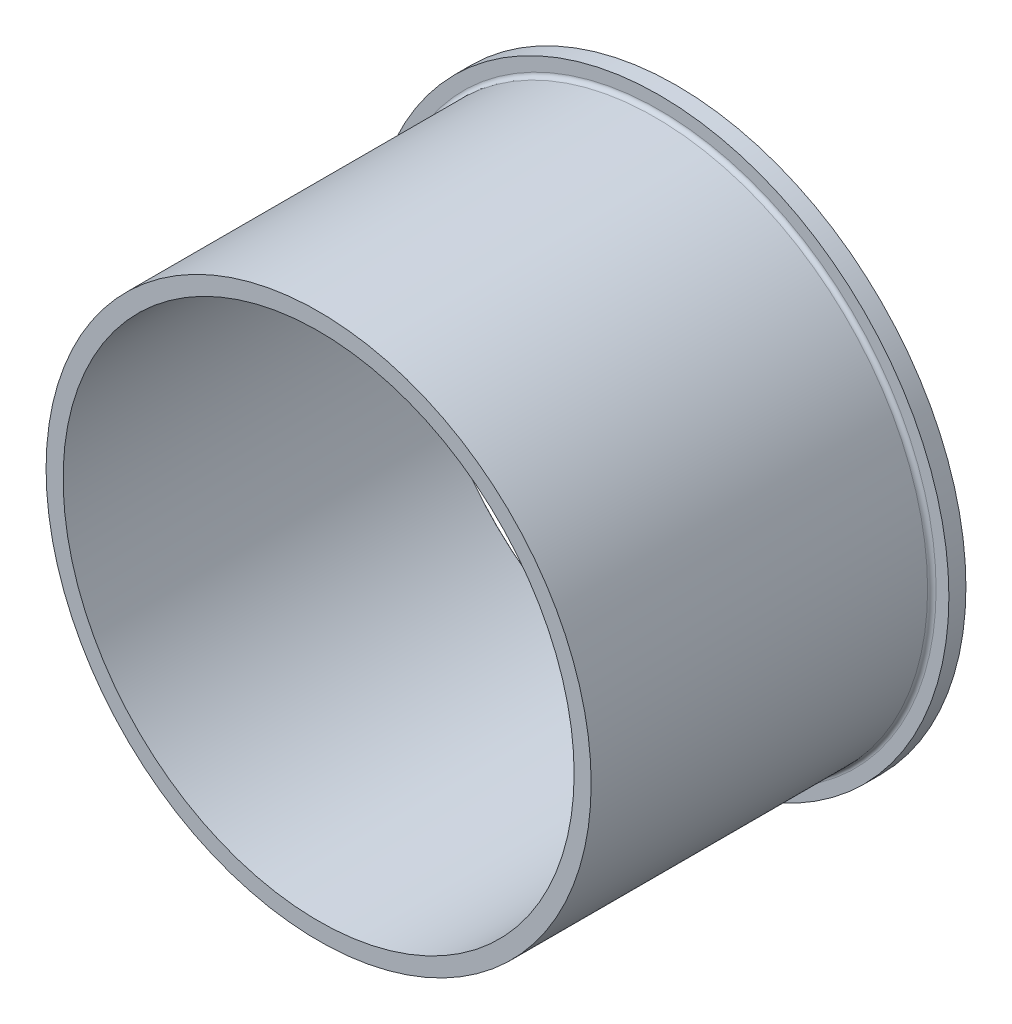
ISO-10303-21;
HEADER;
FILE_DESCRIPTION(('STEP AP214'),'2;1');
FILE_NAME('part.step','',(''),(''),'','','');
FILE_SCHEMA(('AUTOMOTIVE_DESIGN { 1 0 10303 214 1 1 1 1 }'));
ENDSEC;
DATA;
#1=APPLICATION_CONTEXT('core data for automotive mechanical design processes');
#2=APPLICATION_PROTOCOL_DEFINITION('international standard','automotive_design',2000,#1);
#3=PRODUCT_CONTEXT('',#1,'mechanical');
#4=PRODUCT('Part','Part','',(#3));
#5=PRODUCT_RELATED_PRODUCT_CATEGORY('part','',(#4));
#6=PRODUCT_DEFINITION_FORMATION('','',#4);
#7=PRODUCT_DEFINITION_CONTEXT('part definition',#1,'design');
#8=PRODUCT_DEFINITION('design','',#6,#7);
#9=PRODUCT_DEFINITION_SHAPE('','',#8);
#10=(LENGTH_UNIT() NAMED_UNIT(*) SI_UNIT(.MILLI.,.METRE.));
#11=(NAMED_UNIT(*) PLANE_ANGLE_UNIT() SI_UNIT($,.RADIAN.));
#12=(NAMED_UNIT(*) SI_UNIT($,.STERADIAN.) SOLID_ANGLE_UNIT());
#13=UNCERTAINTY_MEASURE_WITH_UNIT(LENGTH_MEASURE(1.E-05),#10,'distance_accuracy_value','');
#14=(GEOMETRIC_REPRESENTATION_CONTEXT(3) GLOBAL_UNCERTAINTY_ASSIGNED_CONTEXT((#13)) GLOBAL_UNIT_ASSIGNED_CONTEXT((#10,
#11,#12)) REPRESENTATION_CONTEXT('',''));
#15=CARTESIAN_POINT('',(0.,0.,0.));
#16=DIRECTION('',(0.,0.,1.));
#17=DIRECTION('',(1.,0.,0.));
#18=AXIS2_PLACEMENT_3D('',#15,#16,#17);
#19=CARTESIAN_POINT('',(0.,0.,0.));
#20=DIRECTION('',(0.,0.,-1.));
#21=DIRECTION('',(1.,0.,0.));
#22=AXIS2_PLACEMENT_3D('',#19,#20,#21);
#23=CYLINDRICAL_SURFACE('',#22,16.);
#24=DIRECTION('',(0.,0.,1.));
#25=VECTOR('',#24,1.);
#26=CARTESIAN_POINT('',(16.,0.,0.));
#27=LINE('',#26,#25);
#28=CARTESIAN_POINT('',(16.,0.,1.2499));
#29=VERTEX_POINT('',#28);
#30=CARTESIAN_POINT('',(16.,0.,21.));
#31=VERTEX_POINT('',#30);
#32=EDGE_CURVE('E11',#29,#31,#27,.T.);
#33=ORIENTED_EDGE('',*,*,#32,.T.);
#34=CARTESIAN_POINT('',(0.,0.,21.));
#35=DIRECTION('',(0.,0.,1.));
#36=DIRECTION('',(1.,0.,0.));
#37=AXIS2_PLACEMENT_3D('',#34,#35,#36);
#38=CIRCLE('',#37,16.);
#39=EDGE_CURVE('E74',#31,#31,#38,.T.);
#40=ORIENTED_EDGE('',*,*,#39,.F.);
#41=ORIENTED_EDGE('',*,*,#32,.F.);
#42=CARTESIAN_POINT('',(0.,0.,1.2499));
#43=DIRECTION('',(0.,0.,-1.));
#44=DIRECTION('',(1.,0.,0.));
#45=AXIS2_PLACEMENT_3D('',#42,#43,#44);
#46=CIRCLE('',#45,16.);
#47=EDGE_CURVE('E66',#29,#29,#46,.T.);
#48=ORIENTED_EDGE('',*,*,#47,.F.);
#49=EDGE_LOOP('',(#33,#40,#41,#48));
#50=FACE_BOUND('',#49,.T.);
#51=ADVANCED_FACE('F57',(#50),#23,.T.);
#52=CARTESIAN_POINT('',(0.,0.,0.));
#53=DIRECTION('',(0.,0.,-1.));
#54=DIRECTION('',(1.,0.,0.));
#55=AXIS2_PLACEMENT_3D('',#52,#53,#54);
#56=CYLINDRICAL_SURFACE('',#55,15.);
#57=CARTESIAN_POINT('',(0.,0.,21.));
#58=DIRECTION('',(0.,0.,1.));
#59=DIRECTION('',(1.,0.,0.));
#60=AXIS2_PLACEMENT_3D('',#57,#58,#59);
#61=CIRCLE('',#60,15.);
#62=CARTESIAN_POINT('',(15.,0.,21.));
#63=VERTEX_POINT('',#62);
#64=EDGE_CURVE('E60',#63,#63,#61,.F.);
#65=ORIENTED_EDGE('',*,*,#64,.F.);
#66=DIRECTION('',(0.,0.,1.));
#67=VECTOR('',#66,1.);
#68=CARTESIAN_POINT('',(15.,0.,0.));
#69=LINE('',#68,#67);
#70=CARTESIAN_POINT('',(15.,0.,0.01));
#71=VERTEX_POINT('',#70);
#72=EDGE_CURVE('E126',#71,#63,#69,.T.);
#73=ORIENTED_EDGE('',*,*,#72,.F.);
#74=CARTESIAN_POINT('',(0.,0.,0.01));
#75=DIRECTION('',(0.,0.,1.));
#76=DIRECTION('',(1.,0.,0.));
#77=AXIS2_PLACEMENT_3D('',#74,#75,#76);
#78=CIRCLE('',#77,15.);
#79=EDGE_CURVE('E103',#71,#71,#78,.T.);
#80=ORIENTED_EDGE('',*,*,#79,.F.);
#81=ORIENTED_EDGE('',*,*,#72,.T.);
#82=EDGE_LOOP('',(#65,#73,#80,#81));
#83=FACE_BOUND('',#82,.T.);
#84=ADVANCED_FACE('F135',(#83),#56,.F.);
#85=CARTESIAN_POINT('',(0.,0.,1.));
#86=DIRECTION('',(0.,0.,1.));
#87=DIRECTION('',(1.,0.,0.));
#88=AXIS2_PLACEMENT_3D('',#85,#86,#87);
#89=PLANE('',#88);
#90=CARTESIAN_POINT('',(0.,0.,1.));
#91=DIRECTION('',(0.,0.,-1.));
#92=DIRECTION('',(1.,0.,0.));
#93=AXIS2_PLACEMENT_3D('',#90,#91,#92);
#94=CIRCLE('',#93,16.2499);
#95=CARTESIAN_POINT('',(16.2499,0.,1.));
#96=VERTEX_POINT('',#95);
#97=EDGE_CURVE('E122',#96,#96,#94,.T.);
#98=ORIENTED_EDGE('',*,*,#97,.T.);
#99=EDGE_LOOP('',(#98));
#100=FACE_BOUND('',#99,.T.);
#101=CARTESIAN_POINT('',(0.,0.,1.));
#102=DIRECTION('',(0.,0.,1.));
#103=DIRECTION('',(1.,0.,0.));
#104=AXIS2_PLACEMENT_3D('',#101,#102,#103);
#105=CIRCLE('',#104,17.);
#106=CARTESIAN_POINT('',(17.,0.,1.));
#107=VERTEX_POINT('',#106);
#108=EDGE_CURVE('E116',#107,#107,#105,.T.);
#109=ORIENTED_EDGE('',*,*,#108,.T.);
#110=EDGE_LOOP('',(#109));
#111=FACE_BOUND('',#110,.T.);
#112=ADVANCED_FACE('F143',(#100,#111),#89,.T.);
#113=CARTESIAN_POINT('',(0.,0.,0.));
#114=DIRECTION('',(0.,0.,1.));
#115=DIRECTION('',(1.,0.,0.));
#116=AXIS2_PLACEMENT_3D('',#113,#114,#115);
#117=PLANE('',#116);
#118=CARTESIAN_POINT('',(0.,0.,0.));
#119=DIRECTION('',(0.,0.,1.));
#120=DIRECTION('',(1.,0.,0.));
#121=AXIS2_PLACEMENT_3D('',#118,#119,#120);
#122=CIRCLE('',#121,15.004663076582);
#123=CARTESIAN_POINT('',(15.004663076582,0.,0.));
#124=VERTEX_POINT('',#123);
#125=EDGE_CURVE('E101',#124,#124,#122,.T.);
#126=ORIENTED_EDGE('',*,*,#125,.T.);
#127=EDGE_LOOP('',(#126));
#128=FACE_BOUND('',#127,.T.);
#129=CARTESIAN_POINT('',(0.,0.,0.));
#130=DIRECTION('',(0.,0.,1.));
#131=DIRECTION('',(1.,0.,0.));
#132=AXIS2_PLACEMENT_3D('',#129,#130,#131);
#133=CIRCLE('',#132,17.);
#134=CARTESIAN_POINT('',(17.,0.,0.));
#135=VERTEX_POINT('',#134);
#136=EDGE_CURVE('E110',#135,#135,#133,.T.);
#137=ORIENTED_EDGE('',*,*,#136,.F.);
#138=EDGE_LOOP('',(#137));
#139=FACE_BOUND('',#138,.T.);
#140=ADVANCED_FACE('F107',(#128,#139),#117,.F.);
#141=CARTESIAN_POINT('',(0.,0.,1.2499));
#142=DIRECTION('',(0.,0.,1.));
#143=DIRECTION('',(1.,0.,0.));
#144=AXIS2_PLACEMENT_3D('',#141,#142,#143);
#145=TOROIDAL_SURFACE('',#144,16.2499,0.2499);
#146=CARTESIAN_POINT('',(16.2499,0.,1.2499));
#147=DIRECTION('',(0.,-1.,0.));
#148=DIRECTION('',(1.,0.,0.));
#149=AXIS2_PLACEMENT_3D('',#146,#147,#148);
#150=CIRCLE('',#149,0.2499);
#151=EDGE_CURVE('E119',#29,#96,#150,.T.);
#152=ORIENTED_EDGE('',*,*,#151,.F.);
#153=ORIENTED_EDGE('',*,*,#47,.T.);
#154=ORIENTED_EDGE('',*,*,#151,.T.);
#155=ORIENTED_EDGE('',*,*,#97,.F.);
#156=EDGE_LOOP('',(#152,#153,#154,#155));
#157=FACE_BOUND('',#156,.T.);
#158=ADVANCED_FACE('F155',(#157),#145,.F.);
#159=CARTESIAN_POINT('',(0.,0.,0.01));
#160=DIRECTION('',(0.,0.,-1.));
#161=DIRECTION('',(1.,0.,0.));
#162=AXIS2_PLACEMENT_3D('',#159,#160,#161);
#163=CONICAL_SURFACE('',#162,15.,0.436332312999);
#164=DIRECTION('',(0.422618261740812,0.,-0.906307787036597));
#165=VECTOR('',#164,1.);
#166=CARTESIAN_POINT('',(15.,0.,0.01));
#167=LINE('',#166,#165);
#168=EDGE_CURVE('E98',#71,#124,#167,.T.);
#169=ORIENTED_EDGE('',*,*,#168,.F.);
#170=ORIENTED_EDGE('',*,*,#79,.T.);
#171=ORIENTED_EDGE('',*,*,#168,.T.);
#172=ORIENTED_EDGE('',*,*,#125,.F.);
#173=EDGE_LOOP('',(#169,#170,#171,#172));
#174=FACE_BOUND('',#173,.T.);
#175=ADVANCED_FACE('F100',(#174),#163,.F.);
#176=CARTESIAN_POINT('',(0.,0.,0.));
#177=DIRECTION('',(0.,0.,1.));
#178=DIRECTION('',(1.,0.,0.));
#179=AXIS2_PLACEMENT_3D('',#176,#177,#178);
#180=CYLINDRICAL_SURFACE('',#179,17.);
#181=ORIENTED_EDGE('',*,*,#136,.T.);
#182=EDGE_LOOP('',(#181));
#183=FACE_BOUND('',#182,.T.);
#184=ORIENTED_EDGE('',*,*,#108,.F.);
#185=EDGE_LOOP('',(#184));
#186=FACE_BOUND('',#185,.T.);
#187=ADVANCED_FACE('F145',(#183,#186),#180,.T.);
#188=CARTESIAN_POINT('',(0.,0.,21.));
#189=DIRECTION('',(0.,0.,1.));
#190=DIRECTION('',(1.,0.,0.));
#191=AXIS2_PLACEMENT_3D('',#188,#189,#190);
#192=PLANE('',#191);
#193=ORIENTED_EDGE('',*,*,#39,.T.);
#194=EDGE_LOOP('',(#193));
#195=FACE_BOUND('',#194,.T.);
#196=ORIENTED_EDGE('',*,*,#64,.T.);
#197=EDGE_LOOP('',(#196));
#198=FACE_BOUND('',#197,.T.);
#199=ADVANCED_FACE('F147',(#195,#198),#192,.T.);
#200=CLOSED_SHELL('',(#51,#84,#112,#140,#158,#175,#187,#199));
#201=MANIFOLD_SOLID_BREP('B2',#200);
#202=ADVANCED_BREP_SHAPE_REPRESENTATION('',(#18,#201),#14);
#203=SHAPE_DEFINITION_REPRESENTATION(#9,#202);
ENDSEC;
END-ISO-10303-21;
